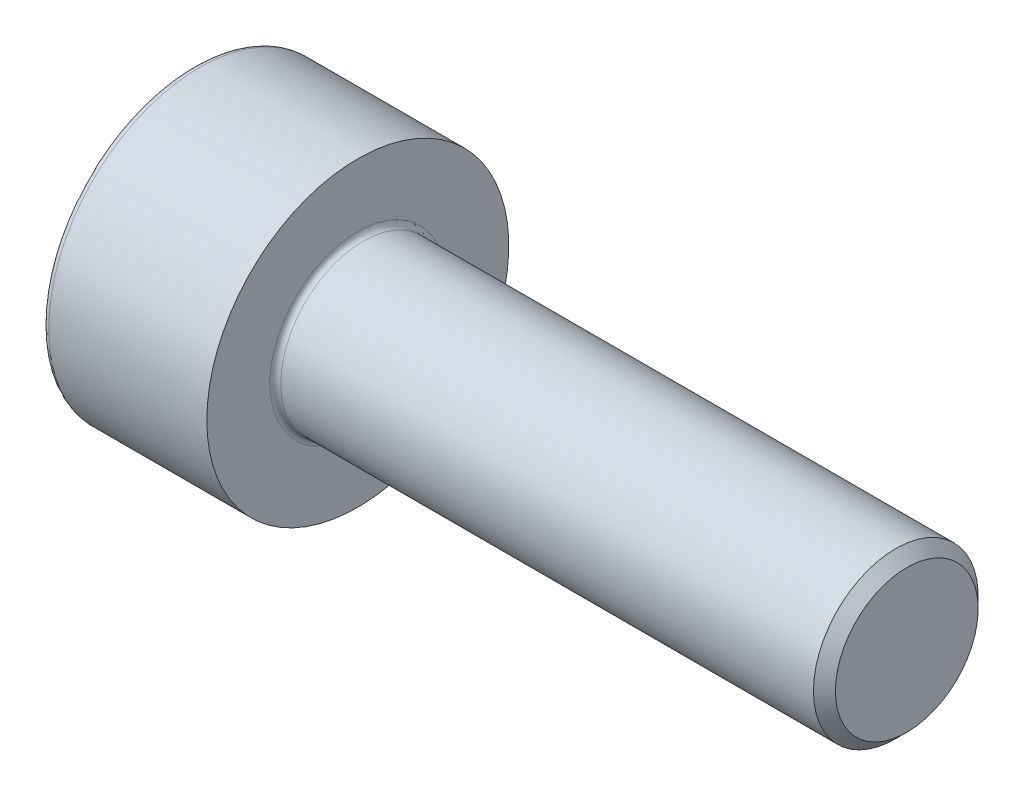
ISO-10303-21;
HEADER;
FILE_DESCRIPTION(('STEP AP214'),'2;1');
FILE_NAME('part.step','',(''),(''),'','','');
FILE_SCHEMA(('AUTOMOTIVE_DESIGN { 1 0 10303 214 1 1 1 1 }'));
ENDSEC;
DATA;
#1=APPLICATION_CONTEXT('core data for automotive mechanical design processes');
#2=APPLICATION_PROTOCOL_DEFINITION('international standard','automotive_design',2000,#1);
#3=PRODUCT_CONTEXT('',#1,'mechanical');
#4=PRODUCT('Part','Part','',(#3));
#5=PRODUCT_RELATED_PRODUCT_CATEGORY('part','',(#4));
#6=PRODUCT_DEFINITION_FORMATION('','',#4);
#7=PRODUCT_DEFINITION_CONTEXT('part definition',#1,'design');
#8=PRODUCT_DEFINITION('design','',#6,#7);
#9=PRODUCT_DEFINITION_SHAPE('','',#8);
#10=(LENGTH_UNIT() NAMED_UNIT(*) SI_UNIT(.MILLI.,.METRE.));
#11=(NAMED_UNIT(*) PLANE_ANGLE_UNIT() SI_UNIT($,.RADIAN.));
#12=(NAMED_UNIT(*) SI_UNIT($,.STERADIAN.) SOLID_ANGLE_UNIT());
#13=UNCERTAINTY_MEASURE_WITH_UNIT(LENGTH_MEASURE(1.E-05),#10,'distance_accuracy_value','');
#14=(GEOMETRIC_REPRESENTATION_CONTEXT(3) GLOBAL_UNCERTAINTY_ASSIGNED_CONTEXT((#13)) GLOBAL_UNIT_ASSIGNED_CONTEXT((#10,
#11,#12)) REPRESENTATION_CONTEXT('',''));
#15=CARTESIAN_POINT('',(0.,0.,0.));
#16=DIRECTION('',(0.,0.,1.));
#17=DIRECTION('',(1.,0.,0.));
#18=AXIS2_PLACEMENT_3D('',#15,#16,#17);
#19=CARTESIAN_POINT('',(13.,0.,0.));
#20=DIRECTION('',(-1.,0.,0.));
#21=DIRECTION('',(0.,0.,1.));
#22=AXIS2_PLACEMENT_3D('',#19,#20,#21);
#23=PLANE('',#22);
#24=CARTESIAN_POINT('',(13.,0.,0.));
#25=DIRECTION('',(-1.,0.,0.));
#26=DIRECTION('',(0.,0.,1.));
#27=AXIS2_PLACEMENT_3D('',#24,#25,#26);
#28=CIRCLE('',#27,1.3);
#29=CARTESIAN_POINT('',(13.,0.,1.3));
#30=VERTEX_POINT('',#29);
#31=EDGE_CURVE('E11',#30,#30,#28,.F.);
#32=ORIENTED_EDGE('',*,*,#31,.T.);
#33=EDGE_LOOP('',(#32));
#34=FACE_BOUND('',#33,.T.);
#35=ADVANCED_FACE('F37',(#34),#23,.F.);
#36=CARTESIAN_POINT('',(0.,0.,0.));
#37=DIRECTION('',(-1.,0.,0.));
#38=DIRECTION('',(0.,0.,1.));
#39=AXIS2_PLACEMENT_3D('',#36,#37,#38);
#40=CYLINDRICAL_SURFACE('',#39,1.5);
#41=CARTESIAN_POINT('',(12.8,0.,0.));
#42=DIRECTION('',(-1.,0.,0.));
#43=DIRECTION('',(0.,0.,1.));
#44=AXIS2_PLACEMENT_3D('',#41,#42,#43);
#45=CIRCLE('',#44,1.5);
#46=CARTESIAN_POINT('',(12.8,0.,1.5));
#47=VERTEX_POINT('',#46);
#48=EDGE_CURVE('E45',#47,#47,#45,.T.);
#49=ORIENTED_EDGE('',*,*,#48,.T.);
#50=EDGE_LOOP('',(#49));
#51=FACE_BOUND('',#50,.T.);
#52=CARTESIAN_POINT('',(3.1,0.,0.));
#53=DIRECTION('',(1.,0.,0.));
#54=DIRECTION('',(0.,0.,-1.));
#55=AXIS2_PLACEMENT_3D('',#52,#53,#54);
#56=CIRCLE('',#55,1.5);
#57=CARTESIAN_POINT('',(3.1,0.,-1.5));
#58=VERTEX_POINT('',#57);
#59=EDGE_CURVE('E150',#58,#58,#56,.T.);
#60=ORIENTED_EDGE('',*,*,#59,.T.);
#61=EDGE_LOOP('',(#60));
#62=FACE_BOUND('',#61,.T.);
#63=ADVANCED_FACE('F161',(#51,#62),#40,.T.);
#64=CARTESIAN_POINT('',(3.,0.,0.));
#65=DIRECTION('',(1.,0.,0.));
#66=DIRECTION('',(0.,0.,-1.));
#67=AXIS2_PLACEMENT_3D('',#64,#65,#66);
#68=PLANE('',#67);
#69=CARTESIAN_POINT('',(3.,0.,0.));
#70=DIRECTION('',(1.,0.,0.));
#71=DIRECTION('',(0.,0.,-1.));
#72=AXIS2_PLACEMENT_3D('',#69,#70,#71);
#73=CIRCLE('',#72,1.6);
#74=CARTESIAN_POINT('',(3.,0.,-1.6));
#75=VERTEX_POINT('',#74);
#76=EDGE_CURVE('E147',#75,#75,#73,.F.);
#77=ORIENTED_EDGE('',*,*,#76,.T.);
#78=EDGE_LOOP('',(#77));
#79=FACE_BOUND('',#78,.T.);
#80=CARTESIAN_POINT('',(3.,0.,0.));
#81=DIRECTION('',(-1.,0.,0.));
#82=DIRECTION('',(0.,0.,1.));
#83=AXIS2_PLACEMENT_3D('',#80,#81,#82);
#84=CIRCLE('',#83,2.75);
#85=CARTESIAN_POINT('',(3.,0.,2.75));
#86=VERTEX_POINT('',#85);
#87=EDGE_CURVE('E139',#86,#86,#84,.T.);
#88=ORIENTED_EDGE('',*,*,#87,.F.);
#89=EDGE_LOOP('',(#88));
#90=FACE_BOUND('',#89,.T.);
#91=ADVANCED_FACE('F183',(#79,#90),#68,.T.);
#92=CARTESIAN_POINT('',(0.,0.,0.));
#93=DIRECTION('',(-1.,0.,0.));
#94=DIRECTION('',(0.,0.,1.));
#95=AXIS2_PLACEMENT_3D('',#92,#93,#94);
#96=CYLINDRICAL_SURFACE('',#95,2.75);
#97=CARTESIAN_POINT('',(0.12,0.,0.));
#98=DIRECTION('',(-1.,0.,0.));
#99=DIRECTION('',(0.,0.,1.));
#100=AXIS2_PLACEMENT_3D('',#97,#98,#99);
#101=CIRCLE('',#100,2.75);
#102=CARTESIAN_POINT('',(0.12,0.,2.75));
#103=VERTEX_POINT('',#102);
#104=EDGE_CURVE('E156',#103,#103,#101,.F.);
#105=ORIENTED_EDGE('',*,*,#104,.T.);
#106=EDGE_LOOP('',(#105));
#107=FACE_BOUND('',#106,.T.);
#108=ORIENTED_EDGE('',*,*,#87,.T.);
#109=EDGE_LOOP('',(#108));
#110=FACE_BOUND('',#109,.T.);
#111=ADVANCED_FACE('F193',(#107,#110),#96,.T.);
#112=CARTESIAN_POINT('',(0.,0.,0.));
#113=DIRECTION('',(-1.,0.,0.));
#114=DIRECTION('',(0.,0.,1.));
#115=AXIS2_PLACEMENT_3D('',#112,#113,#114);
#116=PLANE('',#115);
#117=DIRECTION('',(0.,0.5,-0.866025403784439));
#118=VECTOR('',#117,1.);
#119=CARTESIAN_POINT('',(0.,0.721687836487033,1.25));
#120=LINE('',#119,#118);
#121=CARTESIAN_POINT('',(0.,0.721687836487033,1.25));
#122=VERTEX_POINT('',#121);
#123=CARTESIAN_POINT('',(0.,1.44337567297406,0.));
#124=VERTEX_POINT('',#123);
#125=EDGE_CURVE('E52',#122,#124,#120,.T.);
#126=ORIENTED_EDGE('',*,*,#125,.F.);
#127=DIRECTION('',(0.,1.,0.));
#128=VECTOR('',#127,1.);
#129=CARTESIAN_POINT('',(0.,-0.721687836487032,1.25));
#130=LINE('',#129,#128);
#131=CARTESIAN_POINT('',(0.,-0.721687836487032,1.25));
#132=VERTEX_POINT('',#131);
#133=EDGE_CURVE('E135',#132,#122,#130,.T.);
#134=ORIENTED_EDGE('',*,*,#133,.F.);
#135=DIRECTION('',(0.,0.5,0.866025403784439));
#136=VECTOR('',#135,1.);
#137=CARTESIAN_POINT('',(0.,-1.44337567297406,0.));
#138=LINE('',#137,#136);
#139=CARTESIAN_POINT('',(0.,-1.44337567297406,0.));
#140=VERTEX_POINT('',#139);
#141=EDGE_CURVE('E133',#140,#132,#138,.T.);
#142=ORIENTED_EDGE('',*,*,#141,.F.);
#143=DIRECTION('',(0.,-0.5,0.866025403784439));
#144=VECTOR('',#143,1.);
#145=CARTESIAN_POINT('',(0.,-0.721687836487033,-1.25));
#146=LINE('',#145,#144);
#147=CARTESIAN_POINT('',(0.,-0.721687836487033,-1.25));
#148=VERTEX_POINT('',#147);
#149=EDGE_CURVE('E100',#148,#140,#146,.T.);
#150=ORIENTED_EDGE('',*,*,#149,.F.);
#151=DIRECTION('',(0.,-1.,0.));
#152=VECTOR('',#151,1.);
#153=CARTESIAN_POINT('',(0.,0.721687836487032,-1.25));
#154=LINE('',#153,#152);
#155=CARTESIAN_POINT('',(0.,0.721687836487032,-1.25));
#156=VERTEX_POINT('',#155);
#157=EDGE_CURVE('E129',#156,#148,#154,.T.);
#158=ORIENTED_EDGE('',*,*,#157,.F.);
#159=DIRECTION('',(0.,-0.5,-0.866025403784439));
#160=VECTOR('',#159,1.);
#161=CARTESIAN_POINT('',(0.,1.44337567297406,0.));
#162=LINE('',#161,#160);
#163=EDGE_CURVE('E126',#124,#156,#162,.T.);
#164=ORIENTED_EDGE('',*,*,#163,.F.);
#165=EDGE_LOOP('',(#126,#134,#142,#150,#158,#164));
#166=FACE_BOUND('',#165,.T.);
#167=CARTESIAN_POINT('',(0.,0.,0.));
#168=DIRECTION('',(-1.,0.,0.));
#169=DIRECTION('',(0.,0.,1.));
#170=AXIS2_PLACEMENT_3D('',#167,#168,#169);
#171=CIRCLE('',#170,2.63);
#172=CARTESIAN_POINT('',(0.,0.,2.63));
#173=VERTEX_POINT('',#172);
#174=EDGE_CURVE('E153',#173,#173,#171,.T.);
#175=ORIENTED_EDGE('',*,*,#174,.T.);
#176=EDGE_LOOP('',(#175));
#177=FACE_BOUND('',#176,.T.);
#178=ADVANCED_FACE('F188',(#166,#177),#116,.T.);
#179=CARTESIAN_POINT('',(3.1,0.,0.));
#180=DIRECTION('',(1.,0.,0.));
#181=DIRECTION('',(0.,0.,-1.));
#182=AXIS2_PLACEMENT_3D('',#179,#180,#181);
#183=TOROIDAL_SURFACE('',#182,1.6,0.1);
#184=ORIENTED_EDGE('',*,*,#59,.F.);
#185=EDGE_LOOP('',(#184));
#186=FACE_BOUND('',#185,.T.);
#187=ORIENTED_EDGE('',*,*,#76,.F.);
#188=EDGE_LOOP('',(#187));
#189=FACE_BOUND('',#188,.T.);
#190=ADVANCED_FACE('F174',(#186,#189),#183,.F.);
#191=CARTESIAN_POINT('',(0.12,0.,0.));
#192=DIRECTION('',(-1.,0.,0.));
#193=DIRECTION('',(0.,0.,1.));
#194=AXIS2_PLACEMENT_3D('',#191,#192,#193);
#195=TOROIDAL_SURFACE('',#194,2.63,0.12);
#196=ORIENTED_EDGE('',*,*,#104,.F.);
#197=EDGE_LOOP('',(#196));
#198=FACE_BOUND('',#197,.T.);
#199=ORIENTED_EDGE('',*,*,#174,.F.);
#200=EDGE_LOOP('',(#199));
#201=FACE_BOUND('',#200,.T.);
#202=ADVANCED_FACE('F166',(#198,#201),#195,.T.);
#203=CARTESIAN_POINT('',(12.8,0.,0.));
#204=DIRECTION('',(-1.,0.,0.));
#205=DIRECTION('',(0.,0.,1.));
#206=AXIS2_PLACEMENT_3D('',#203,#204,#205);
#207=CONICAL_SURFACE('',#206,1.5,0.785398163397448);
#208=ORIENTED_EDGE('',*,*,#31,.F.);
#209=EDGE_LOOP('',(#208));
#210=FACE_BOUND('',#209,.T.);
#211=ORIENTED_EDGE('',*,*,#48,.F.);
#212=EDGE_LOOP('',(#211));
#213=FACE_BOUND('',#212,.T.);
#214=ADVANCED_FACE('F39',(#210,#213),#207,.T.);
#215=CARTESIAN_POINT('',(1.,0.721687836487033,1.25));
#216=DIRECTION('',(0.,0.866025403784439,0.5));
#217=DIRECTION('',(0.,-0.5,0.866025403784439));
#218=AXIS2_PLACEMENT_3D('',#215,#216,#217);
#219=PLANE('',#218);
#220=ORIENTED_EDGE('',*,*,#125,.T.);
#221=DIRECTION('',(-1.,0.,0.));
#222=VECTOR('',#221,1.);
#223=CARTESIAN_POINT('',(1.,1.44337567297406,0.));
#224=LINE('',#223,#222);
#225=CARTESIAN_POINT('',(1.,1.44337567297406,0.));
#226=VERTEX_POINT('',#225);
#227=EDGE_CURVE('E82',#226,#124,#224,.T.);
#228=ORIENTED_EDGE('',*,*,#227,.F.);
#229=DIRECTION('',(0.,0.5,-0.866025403784439));
#230=VECTOR('',#229,1.);
#231=CARTESIAN_POINT('',(1.,0.721687836487033,1.25));
#232=LINE('',#231,#230);
#233=CARTESIAN_POINT('',(1.,0.721687836487033,1.25));
#234=VERTEX_POINT('',#233);
#235=EDGE_CURVE('E137',#234,#226,#232,.T.);
#236=ORIENTED_EDGE('',*,*,#235,.F.);
#237=DIRECTION('',(-1.,0.,0.));
#238=VECTOR('',#237,1.);
#239=CARTESIAN_POINT('',(1.,0.721687836487033,1.25));
#240=LINE('',#239,#238);
#241=EDGE_CURVE('E60',#234,#122,#240,.T.);
#242=ORIENTED_EDGE('',*,*,#241,.T.);
#243=EDGE_LOOP('',(#220,#228,#236,#242));
#244=FACE_BOUND('',#243,.T.);
#245=ADVANCED_FACE('F165',(#244),#219,.F.);
#246=CARTESIAN_POINT('',(1.,-0.721687836487032,1.25));
#247=DIRECTION('',(0.,0.,1.));
#248=DIRECTION('',(0.,-1.,0.));
#249=AXIS2_PLACEMENT_3D('',#246,#247,#248);
#250=PLANE('',#249);
#251=ORIENTED_EDGE('',*,*,#133,.T.);
#252=ORIENTED_EDGE('',*,*,#241,.F.);
#253=DIRECTION('',(0.,1.,0.));
#254=VECTOR('',#253,1.);
#255=CARTESIAN_POINT('',(1.,-0.721687836487032,1.25));
#256=LINE('',#255,#254);
#257=CARTESIAN_POINT('',(1.,-0.721687836487032,1.25));
#258=VERTEX_POINT('',#257);
#259=EDGE_CURVE('E112',#258,#234,#256,.T.);
#260=ORIENTED_EDGE('',*,*,#259,.F.);
#261=DIRECTION('',(-1.,0.,0.));
#262=VECTOR('',#261,1.);
#263=CARTESIAN_POINT('',(1.,-0.721687836487032,1.25));
#264=LINE('',#263,#262);
#265=EDGE_CURVE('E104',#258,#132,#264,.T.);
#266=ORIENTED_EDGE('',*,*,#265,.T.);
#267=EDGE_LOOP('',(#251,#252,#260,#266));
#268=FACE_BOUND('',#267,.T.);
#269=ADVANCED_FACE('F172',(#268),#250,.F.);
#270=CARTESIAN_POINT('',(1.,-1.44337567297406,0.));
#271=DIRECTION('',(0.,-0.866025403784439,0.5));
#272=DIRECTION('',(0.,-0.5,-0.866025403784439));
#273=AXIS2_PLACEMENT_3D('',#270,#271,#272);
#274=PLANE('',#273);
#275=ORIENTED_EDGE('',*,*,#141,.T.);
#276=ORIENTED_EDGE('',*,*,#265,.F.);
#277=DIRECTION('',(0.,0.5,0.866025403784439));
#278=VECTOR('',#277,1.);
#279=CARTESIAN_POINT('',(1.,-1.44337567297406,0.));
#280=LINE('',#279,#278);
#281=CARTESIAN_POINT('',(1.,-1.44337567297406,0.));
#282=VERTEX_POINT('',#281);
#283=EDGE_CURVE('E108',#282,#258,#280,.T.);
#284=ORIENTED_EDGE('',*,*,#283,.F.);
#285=DIRECTION('',(-1.,0.,0.));
#286=VECTOR('',#285,1.);
#287=CARTESIAN_POINT('',(1.,-1.44337567297406,0.));
#288=LINE('',#287,#286);
#289=EDGE_CURVE('E93',#282,#140,#288,.T.);
#290=ORIENTED_EDGE('',*,*,#289,.T.);
#291=EDGE_LOOP('',(#275,#276,#284,#290));
#292=FACE_BOUND('',#291,.T.);
#293=ADVANCED_FACE('F109',(#292),#274,.F.);
#294=CARTESIAN_POINT('',(1.,-0.721687836487033,-1.25));
#295=DIRECTION('',(0.,-0.866025403784439,-0.5));
#296=DIRECTION('',(0.,0.5,-0.866025403784439));
#297=AXIS2_PLACEMENT_3D('',#294,#295,#296);
#298=PLANE('',#297);
#299=ORIENTED_EDGE('',*,*,#149,.T.);
#300=ORIENTED_EDGE('',*,*,#289,.F.);
#301=DIRECTION('',(0.,-0.5,0.866025403784439));
#302=VECTOR('',#301,1.);
#303=CARTESIAN_POINT('',(1.,-0.721687836487033,-1.25));
#304=LINE('',#303,#302);
#305=CARTESIAN_POINT('',(1.,-0.721687836487033,-1.25));
#306=VERTEX_POINT('',#305);
#307=EDGE_CURVE('E97',#306,#282,#304,.T.);
#308=ORIENTED_EDGE('',*,*,#307,.F.);
#309=DIRECTION('',(-1.,0.,0.));
#310=VECTOR('',#309,1.);
#311=CARTESIAN_POINT('',(1.,-0.721687836487033,-1.25));
#312=LINE('',#311,#310);
#313=EDGE_CURVE('E105',#306,#148,#312,.T.);
#314=ORIENTED_EDGE('',*,*,#313,.T.);
#315=EDGE_LOOP('',(#299,#300,#308,#314));
#316=FACE_BOUND('',#315,.T.);
#317=ADVANCED_FACE('F95',(#316),#298,.F.);
#318=CARTESIAN_POINT('',(1.,0.721687836487032,-1.25));
#319=DIRECTION('',(0.,0.,-1.));
#320=DIRECTION('',(0.,1.,0.));
#321=AXIS2_PLACEMENT_3D('',#318,#319,#320);
#322=PLANE('',#321);
#323=ORIENTED_EDGE('',*,*,#157,.T.);
#324=ORIENTED_EDGE('',*,*,#313,.F.);
#325=DIRECTION('',(0.,-1.,0.));
#326=VECTOR('',#325,1.);
#327=CARTESIAN_POINT('',(1.,0.721687836487032,-1.25));
#328=LINE('',#327,#326);
#329=CARTESIAN_POINT('',(1.,0.721687836487032,-1.25));
#330=VERTEX_POINT('',#329);
#331=EDGE_CURVE('E118',#330,#306,#328,.T.);
#332=ORIENTED_EDGE('',*,*,#331,.F.);
#333=DIRECTION('',(-1.,0.,0.));
#334=VECTOR('',#333,1.);
#335=CARTESIAN_POINT('',(1.,0.721687836487032,-1.25));
#336=LINE('',#335,#334);
#337=EDGE_CURVE('E142',#330,#156,#336,.T.);
#338=ORIENTED_EDGE('',*,*,#337,.T.);
#339=EDGE_LOOP('',(#323,#324,#332,#338));
#340=FACE_BOUND('',#339,.T.);
#341=ADVANCED_FACE('F213',(#340),#322,.F.);
#342=CARTESIAN_POINT('',(1.,1.44337567297406,0.));
#343=DIRECTION('',(0.,0.866025403784439,-0.5));
#344=DIRECTION('',(0.,0.5,0.866025403784439));
#345=AXIS2_PLACEMENT_3D('',#342,#343,#344);
#346=PLANE('',#345);
#347=ORIENTED_EDGE('',*,*,#163,.T.);
#348=ORIENTED_EDGE('',*,*,#337,.F.);
#349=DIRECTION('',(0.,-0.5,-0.866025403784439));
#350=VECTOR('',#349,1.);
#351=CARTESIAN_POINT('',(1.,1.44337567297406,0.));
#352=LINE('',#351,#350);
#353=EDGE_CURVE('E120',#226,#330,#352,.T.);
#354=ORIENTED_EDGE('',*,*,#353,.F.);
#355=ORIENTED_EDGE('',*,*,#227,.T.);
#356=EDGE_LOOP('',(#347,#348,#354,#355));
#357=FACE_BOUND('',#356,.T.);
#358=ADVANCED_FACE('F210',(#357),#346,.F.);
#359=CARTESIAN_POINT('',(1.,0.,0.));
#360=DIRECTION('',(-1.,0.,0.));
#361=DIRECTION('',(0.,0.,1.));
#362=AXIS2_PLACEMENT_3D('',#359,#360,#361);
#363=PLANE('',#362);
#364=ORIENTED_EDGE('',*,*,#235,.T.);
#365=ORIENTED_EDGE('',*,*,#353,.T.);
#366=ORIENTED_EDGE('',*,*,#331,.T.);
#367=ORIENTED_EDGE('',*,*,#307,.T.);
#368=ORIENTED_EDGE('',*,*,#283,.T.);
#369=ORIENTED_EDGE('',*,*,#259,.T.);
#370=EDGE_LOOP('',(#364,#365,#366,#367,#368,#369));
#371=FACE_BOUND('',#370,.T.);
#372=ADVANCED_FACE('F115',(#371),#363,.T.);
#373=CLOSED_SHELL('',(#35,#63,#91,#111,#178,#190,#202,#214,#245,#269,#293,#317,#341,#358,#372));
#374=MANIFOLD_SOLID_BREP('B2',#373);
#375=ADVANCED_BREP_SHAPE_REPRESENTATION('',(#18,#374),#14);
#376=SHAPE_DEFINITION_REPRESENTATION(#9,#375);
ENDSEC;
END-ISO-10303-21;
